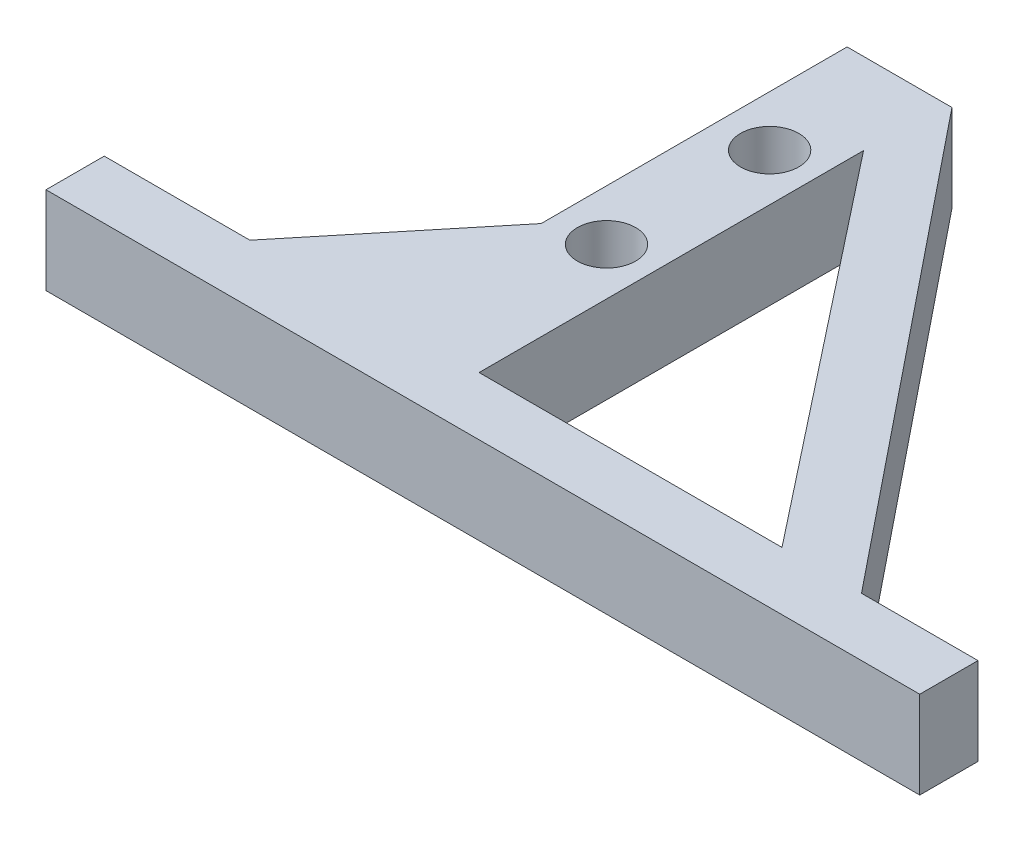
ISO-10303-21;
HEADER;
FILE_DESCRIPTION(('STEP AP214'),'2;1');
FILE_NAME('part.step','',(''),(''),'','','');
FILE_SCHEMA(('AUTOMOTIVE_DESIGN { 1 0 10303 214 1 1 1 1 }'));
ENDSEC;
DATA;
#1=APPLICATION_CONTEXT('core data for automotive mechanical design processes');
#2=APPLICATION_PROTOCOL_DEFINITION('international standard','automotive_design',2000,#1);
#3=PRODUCT_CONTEXT('',#1,'mechanical');
#4=PRODUCT('Part','Part','',(#3));
#5=PRODUCT_RELATED_PRODUCT_CATEGORY('part','',(#4));
#6=PRODUCT_DEFINITION_FORMATION('','',#4);
#7=PRODUCT_DEFINITION_CONTEXT('part definition',#1,'design');
#8=PRODUCT_DEFINITION('design','',#6,#7);
#9=PRODUCT_DEFINITION_SHAPE('','',#8);
#10=(LENGTH_UNIT() NAMED_UNIT(*) SI_UNIT(.MILLI.,.METRE.));
#11=(NAMED_UNIT(*) PLANE_ANGLE_UNIT() SI_UNIT($,.RADIAN.));
#12=(NAMED_UNIT(*) SI_UNIT($,.STERADIAN.) SOLID_ANGLE_UNIT());
#13=UNCERTAINTY_MEASURE_WITH_UNIT(LENGTH_MEASURE(1.E-05),#10,'distance_accuracy_value','');
#14=(GEOMETRIC_REPRESENTATION_CONTEXT(3) GLOBAL_UNCERTAINTY_ASSIGNED_CONTEXT((#13)) GLOBAL_UNIT_ASSIGNED_CONTEXT((#10,
#11,#12)) REPRESENTATION_CONTEXT('',''));
#15=CARTESIAN_POINT('',(0.,0.,0.));
#16=DIRECTION('',(0.,0.,1.));
#17=DIRECTION('',(1.,0.,0.));
#18=AXIS2_PLACEMENT_3D('',#15,#16,#17);
#19=CARTESIAN_POINT('',(0.,19.05,0.));
#20=DIRECTION('',(0.,-1.,0.));
#21=DIRECTION('',(0.,0.,-1.));
#22=AXIS2_PLACEMENT_3D('',#19,#20,#21);
#23=PLANE('',#22);
#24=DIRECTION('',(0.,0.,1.));
#25=VECTOR('',#24,1.);
#26=CARTESIAN_POINT('',(0.,19.05,0.));
#27=LINE('',#26,#25);
#28=CARTESIAN_POINT('',(0.,19.05,-12.7));
#29=VERTEX_POINT('',#28);
#30=CARTESIAN_POINT('',(0.,19.05,0.));
#31=VERTEX_POINT('',#30);
#32=EDGE_CURVE('E152',#29,#31,#27,.T.);
#33=ORIENTED_EDGE('',*,*,#32,.T.);
#34=DIRECTION('',(1.,0.,0.));
#35=VECTOR('',#34,1.);
#36=CARTESIAN_POINT('',(0.,19.05,0.));
#37=LINE('',#36,#35);
#38=CARTESIAN_POINT('',(190.5,19.05,0.));
#39=VERTEX_POINT('',#38);
#40=EDGE_CURVE('E155',#31,#39,#37,.T.);
#41=ORIENTED_EDGE('',*,*,#40,.T.);
#42=DIRECTION('',(0.,0.,-1.));
#43=VECTOR('',#42,1.);
#44=CARTESIAN_POINT('',(190.5,19.05,0.));
#45=LINE('',#44,#43);
#46=CARTESIAN_POINT('',(190.5,19.05,-12.7));
#47=VERTEX_POINT('',#46);
#48=EDGE_CURVE('E158',#39,#47,#45,.T.);
#49=ORIENTED_EDGE('',*,*,#48,.T.);
#50=DIRECTION('',(-1.,0.,0.));
#51=VECTOR('',#50,1.);
#52=CARTESIAN_POINT('',(165.1,19.05,-12.7));
#53=LINE('',#52,#51);
#54=CARTESIAN_POINT('',(165.1,19.05,-12.7));
#55=VERTEX_POINT('',#54);
#56=EDGE_CURVE('E160',#47,#55,#53,.T.);
#57=ORIENTED_EDGE('',*,*,#56,.T.);
#58=DIRECTION('',(-0.627483273754374,0.,-0.778630041263817));
#59=VECTOR('',#58,1.);
#60=CARTESIAN_POINT('',(83.2224750717733,19.05,-114.3));
#61=LINE('',#60,#59);
#62=CARTESIAN_POINT('',(83.2224750717733,19.05,-114.3));
#63=VERTEX_POINT('',#62);
#64=EDGE_CURVE('E162',#55,#63,#61,.T.);
#65=ORIENTED_EDGE('',*,*,#64,.T.);
#66=DIRECTION('',(-1.,0.,0.));
#67=VECTOR('',#66,1.);
#68=CARTESIAN_POINT('',(83.2224750717733,19.05,-114.3));
#69=LINE('',#68,#67);
#70=CARTESIAN_POINT('',(60.3624750717733,19.05,-114.3));
#71=VERTEX_POINT('',#70);
#72=EDGE_CURVE('E164',#63,#71,#69,.T.);
#73=ORIENTED_EDGE('',*,*,#72,.T.);
#74=DIRECTION('',(0.,0.,1.));
#75=VECTOR('',#74,1.);
#76=CARTESIAN_POINT('',(60.3624750717733,19.05,-114.3));
#77=LINE('',#76,#75);
#78=CARTESIAN_POINT('',(60.3624750717733,19.05,-47.5946150448349));
#79=VERTEX_POINT('',#78);
#80=EDGE_CURVE('E166',#71,#79,#77,.T.);
#81=ORIENTED_EDGE('',*,*,#80,.T.);
#82=DIRECTION('',(-0.634064889578644,0.,0.77327984313806));
#83=VECTOR('',#82,1.);
#84=CARTESIAN_POINT('',(31.75,19.05,-12.7));
#85=LINE('',#84,#83);
#86=CARTESIAN_POINT('',(31.75,19.05,-12.7));
#87=VERTEX_POINT('',#86);
#88=EDGE_CURVE('E168',#79,#87,#85,.T.);
#89=ORIENTED_EDGE('',*,*,#88,.T.);
#90=DIRECTION('',(-1.,0.,0.));
#91=VECTOR('',#90,1.);
#92=CARTESIAN_POINT('',(0.,19.05,-12.7));
#93=LINE('',#92,#91);
#94=EDGE_CURVE('E170',#87,#29,#93,.T.);
#95=ORIENTED_EDGE('',*,*,#94,.T.);
#96=EDGE_LOOP('',(#33,#41,#49,#57,#65,#73,#81,#89,#95));
#97=FACE_BOUND('',#96,.T.);
#98=DIRECTION('',(-0.618872226603513,0.,-0.785491672227535));
#99=VECTOR('',#98,1.);
#100=CARTESIAN_POINT('',(81.7257807197851,19.05,-96.52));
#101=LINE('',#100,#99);
#102=CARTESIAN_POINT('',(147.765780719785,19.05,-12.7));
#103=VERTEX_POINT('',#102);
#104=CARTESIAN_POINT('',(81.7257807197851,19.05,-96.52));
#105=VERTEX_POINT('',#104);
#106=EDGE_CURVE('E122',#103,#105,#101,.T.);
#107=ORIENTED_EDGE('',*,*,#106,.F.);
#108=DIRECTION('',(1.,0.,0.));
#109=VECTOR('',#108,1.);
#110=CARTESIAN_POINT('',(81.7257807197851,19.05,-12.7));
#111=LINE('',#110,#109);
#112=CARTESIAN_POINT('',(81.7257807197851,19.05,-12.7));
#113=VERTEX_POINT('',#112);
#114=EDGE_CURVE('E140',#113,#103,#111,.T.);
#115=ORIENTED_EDGE('',*,*,#114,.F.);
#116=DIRECTION('',(0.,0.,1.));
#117=VECTOR('',#116,1.);
#118=CARTESIAN_POINT('',(81.7257807197851,19.05,-96.52));
#119=LINE('',#118,#117);
#120=EDGE_CURVE('E130',#105,#113,#119,.T.);
#121=ORIENTED_EDGE('',*,*,#120,.F.);
#122=EDGE_LOOP('',(#107,#115,#121));
#123=FACE_BOUND('',#122,.T.);
#124=CARTESIAN_POINT('',(71.4131855565126,19.05,-86.36));
#125=DIRECTION('',(0.,1.,0.));
#126=DIRECTION('',(0.,0.,1.));
#127=AXIS2_PLACEMENT_3D('',#124,#125,#126);
#128=CIRCLE('',#127,6.34999999999999);
#129=CARTESIAN_POINT('',(71.4131855565126,19.05,-92.71));
#130=VERTEX_POINT('',#129);
#131=EDGE_CURVE('E146',#130,#130,#128,.T.);
#132=ORIENTED_EDGE('',*,*,#131,.F.);
#133=EDGE_LOOP('',(#132));
#134=FACE_BOUND('',#133,.T.);
#135=CARTESIAN_POINT('',(71.4131855565126,19.05,-50.8));
#136=DIRECTION('',(0.,1.,0.));
#137=DIRECTION('',(0.,0.,1.));
#138=AXIS2_PLACEMENT_3D('',#135,#136,#137);
#139=CIRCLE('',#138,6.35);
#140=CARTESIAN_POINT('',(71.4131855565126,19.05,-57.15));
#141=VERTEX_POINT('',#140);
#142=EDGE_CURVE('E391',#141,#141,#139,.T.);
#143=ORIENTED_EDGE('',*,*,#142,.F.);
#144=EDGE_LOOP('',(#143));
#145=FACE_BOUND('',#144,.T.);
#146=ADVANCED_FACE('F33',(#97,#123,#134,#145),#23,.F.);
#147=CARTESIAN_POINT('',(0.,0.,0.));
#148=DIRECTION('',(0.,-1.,0.));
#149=DIRECTION('',(0.,0.,-1.));
#150=AXIS2_PLACEMENT_3D('',#147,#148,#149);
#151=PLANE('',#150);
#152=CARTESIAN_POINT('',(71.4131855565126,0.,-86.36));
#153=DIRECTION('',(0.,1.,0.));
#154=DIRECTION('',(0.,0.,1.));
#155=AXIS2_PLACEMENT_3D('',#152,#153,#154);
#156=CIRCLE('',#155,6.34999999999999);
#157=CARTESIAN_POINT('',(71.4131855565126,0.,-92.71));
#158=VERTEX_POINT('',#157);
#159=EDGE_CURVE('E397',#158,#158,#156,.T.);
#160=ORIENTED_EDGE('',*,*,#159,.T.);
#161=EDGE_LOOP('',(#160));
#162=FACE_BOUND('',#161,.T.);
#163=DIRECTION('',(0.,0.,1.));
#164=VECTOR('',#163,1.);
#165=CARTESIAN_POINT('',(0.,0.,0.));
#166=LINE('',#165,#164);
#167=CARTESIAN_POINT('',(0.,0.,-12.7));
#168=VERTEX_POINT('',#167);
#169=CARTESIAN_POINT('',(0.,0.,0.));
#170=VERTEX_POINT('',#169);
#171=EDGE_CURVE('E137',#168,#170,#166,.T.);
#172=ORIENTED_EDGE('',*,*,#171,.F.);
#173=DIRECTION('',(-1.,0.,0.));
#174=VECTOR('',#173,1.);
#175=CARTESIAN_POINT('',(0.,0.,-12.7));
#176=LINE('',#175,#174);
#177=CARTESIAN_POINT('',(31.75,0.,-12.7));
#178=VERTEX_POINT('',#177);
#179=EDGE_CURVE('E156',#178,#168,#176,.T.);
#180=ORIENTED_EDGE('',*,*,#179,.F.);
#181=DIRECTION('',(-0.634064889578644,0.,0.77327984313806));
#182=VECTOR('',#181,1.);
#183=CARTESIAN_POINT('',(31.75,0.,-12.7));
#184=LINE('',#183,#182);
#185=CARTESIAN_POINT('',(60.3624750717733,0.,-47.5946150448349));
#186=VERTEX_POINT('',#185);
#187=EDGE_CURVE('E187',#186,#178,#184,.T.);
#188=ORIENTED_EDGE('',*,*,#187,.F.);
#189=DIRECTION('',(0.,0.,1.));
#190=VECTOR('',#189,1.);
#191=CARTESIAN_POINT('',(60.3624750717733,0.,-114.3));
#192=LINE('',#191,#190);
#193=CARTESIAN_POINT('',(60.3624750717733,0.,-114.3));
#194=VERTEX_POINT('',#193);
#195=EDGE_CURVE('E185',#194,#186,#192,.T.);
#196=ORIENTED_EDGE('',*,*,#195,.F.);
#197=DIRECTION('',(-1.,0.,0.));
#198=VECTOR('',#197,1.);
#199=CARTESIAN_POINT('',(83.2224750717733,0.,-114.3));
#200=LINE('',#199,#198);
#201=CARTESIAN_POINT('',(83.2224750717733,0.,-114.3));
#202=VERTEX_POINT('',#201);
#203=EDGE_CURVE('E183',#202,#194,#200,.T.);
#204=ORIENTED_EDGE('',*,*,#203,.F.);
#205=DIRECTION('',(-0.627483273754374,0.,-0.778630041263817));
#206=VECTOR('',#205,1.);
#207=CARTESIAN_POINT('',(83.2224750717733,0.,-114.3));
#208=LINE('',#207,#206);
#209=CARTESIAN_POINT('',(165.1,0.,-12.7));
#210=VERTEX_POINT('',#209);
#211=EDGE_CURVE('E181',#210,#202,#208,.T.);
#212=ORIENTED_EDGE('',*,*,#211,.F.);
#213=DIRECTION('',(-1.,0.,0.));
#214=VECTOR('',#213,1.);
#215=CARTESIAN_POINT('',(165.1,0.,-12.7));
#216=LINE('',#215,#214);
#217=CARTESIAN_POINT('',(190.5,0.,-12.7));
#218=VERTEX_POINT('',#217);
#219=EDGE_CURVE('E179',#218,#210,#216,.T.);
#220=ORIENTED_EDGE('',*,*,#219,.F.);
#221=DIRECTION('',(0.,0.,-1.));
#222=VECTOR('',#221,1.);
#223=CARTESIAN_POINT('',(190.5,0.,0.));
#224=LINE('',#223,#222);
#225=CARTESIAN_POINT('',(190.5,0.,0.));
#226=VERTEX_POINT('',#225);
#227=EDGE_CURVE('E177',#226,#218,#224,.T.);
#228=ORIENTED_EDGE('',*,*,#227,.F.);
#229=DIRECTION('',(1.,0.,0.));
#230=VECTOR('',#229,1.);
#231=CARTESIAN_POINT('',(0.,0.,0.));
#232=LINE('',#231,#230);
#233=EDGE_CURVE('E175',#170,#226,#232,.T.);
#234=ORIENTED_EDGE('',*,*,#233,.F.);
#235=EDGE_LOOP('',(#172,#180,#188,#196,#204,#212,#220,#228,#234));
#236=FACE_BOUND('',#235,.T.);
#237=DIRECTION('',(1.,0.,0.));
#238=VECTOR('',#237,1.);
#239=CARTESIAN_POINT('',(81.7257807197851,0.,-12.7));
#240=LINE('',#239,#238);
#241=CARTESIAN_POINT('',(81.7257807197851,0.,-12.7));
#242=VERTEX_POINT('',#241);
#243=CARTESIAN_POINT('',(147.765780719785,0.,-12.7));
#244=VERTEX_POINT('',#243);
#245=EDGE_CURVE('E131',#242,#244,#240,.T.);
#246=ORIENTED_EDGE('',*,*,#245,.T.);
#247=DIRECTION('',(-0.618872226603513,0.,-0.785491672227535));
#248=VECTOR('',#247,1.);
#249=CARTESIAN_POINT('',(81.7257807197851,0.,-96.52));
#250=LINE('',#249,#248);
#251=CARTESIAN_POINT('',(81.7257807197851,0.,-96.52));
#252=VERTEX_POINT('',#251);
#253=EDGE_CURVE('E56',#244,#252,#250,.T.);
#254=ORIENTED_EDGE('',*,*,#253,.T.);
#255=DIRECTION('',(0.,0.,1.));
#256=VECTOR('',#255,1.);
#257=CARTESIAN_POINT('',(81.7257807197851,0.,-96.52));
#258=LINE('',#257,#256);
#259=EDGE_CURVE('E136',#252,#242,#258,.T.);
#260=ORIENTED_EDGE('',*,*,#259,.T.);
#261=EDGE_LOOP('',(#246,#254,#260));
#262=FACE_BOUND('',#261,.T.);
#263=CARTESIAN_POINT('',(71.4131855565126,0.,-50.8));
#264=DIRECTION('',(0.,1.,0.));
#265=DIRECTION('',(0.,0.,1.));
#266=AXIS2_PLACEMENT_3D('',#263,#264,#265);
#267=CIRCLE('',#266,6.35);
#268=CARTESIAN_POINT('',(71.4131855565126,0.,-57.15));
#269=VERTEX_POINT('',#268);
#270=EDGE_CURVE('E394',#269,#269,#267,.T.);
#271=ORIENTED_EDGE('',*,*,#270,.T.);
#272=EDGE_LOOP('',(#271));
#273=FACE_BOUND('',#272,.T.);
#274=ADVANCED_FACE('F220',(#162,#236,#262,#273),#151,.T.);
#275=CARTESIAN_POINT('',(0.,19.05,0.));
#276=DIRECTION('',(1.,0.,0.));
#277=DIRECTION('',(0.,0.,-1.));
#278=AXIS2_PLACEMENT_3D('',#275,#276,#277);
#279=PLANE('',#278);
#280=ORIENTED_EDGE('',*,*,#171,.T.);
#281=DIRECTION('',(0.,-1.,0.));
#282=VECTOR('',#281,1.);
#283=CARTESIAN_POINT('',(0.,19.05,0.));
#284=LINE('',#283,#282);
#285=EDGE_CURVE('E11',#31,#170,#284,.T.);
#286=ORIENTED_EDGE('',*,*,#285,.F.);
#287=ORIENTED_EDGE('',*,*,#32,.F.);
#288=DIRECTION('',(0.,-1.,0.));
#289=VECTOR('',#288,1.);
#290=CARTESIAN_POINT('',(0.,19.05,-12.7));
#291=LINE('',#290,#289);
#292=EDGE_CURVE('E172',#29,#168,#291,.T.);
#293=ORIENTED_EDGE('',*,*,#292,.T.);
#294=EDGE_LOOP('',(#280,#286,#287,#293));
#295=FACE_BOUND('',#294,.T.);
#296=ADVANCED_FACE('F35',(#295),#279,.F.);
#297=CARTESIAN_POINT('',(0.,19.05,0.));
#298=DIRECTION('',(0.,0.,-1.));
#299=DIRECTION('',(-1.,0.,0.));
#300=AXIS2_PLACEMENT_3D('',#297,#298,#299);
#301=PLANE('',#300);
#302=ORIENTED_EDGE('',*,*,#233,.T.);
#303=DIRECTION('',(0.,-1.,0.));
#304=VECTOR('',#303,1.);
#305=CARTESIAN_POINT('',(190.5,19.05,0.));
#306=LINE('',#305,#304);
#307=EDGE_CURVE('E41',#39,#226,#306,.T.);
#308=ORIENTED_EDGE('',*,*,#307,.F.);
#309=ORIENTED_EDGE('',*,*,#40,.F.);
#310=ORIENTED_EDGE('',*,*,#285,.T.);
#311=EDGE_LOOP('',(#302,#308,#309,#310));
#312=FACE_BOUND('',#311,.T.);
#313=ADVANCED_FACE('F237',(#312),#301,.F.);
#314=CARTESIAN_POINT('',(190.5,19.05,0.));
#315=DIRECTION('',(-1.,0.,0.));
#316=DIRECTION('',(0.,0.,1.));
#317=AXIS2_PLACEMENT_3D('',#314,#315,#316);
#318=PLANE('',#317);
#319=ORIENTED_EDGE('',*,*,#227,.T.);
#320=DIRECTION('',(0.,-1.,0.));
#321=VECTOR('',#320,1.);
#322=CARTESIAN_POINT('',(190.5,19.05,-12.7));
#323=LINE('',#322,#321);
#324=EDGE_CURVE('E207',#47,#218,#323,.T.);
#325=ORIENTED_EDGE('',*,*,#324,.F.);
#326=ORIENTED_EDGE('',*,*,#48,.F.);
#327=ORIENTED_EDGE('',*,*,#307,.T.);
#328=EDGE_LOOP('',(#319,#325,#326,#327));
#329=FACE_BOUND('',#328,.T.);
#330=ADVANCED_FACE('F214',(#329),#318,.F.);
#331=CARTESIAN_POINT('',(165.1,19.05,-12.7));
#332=DIRECTION('',(0.,0.,1.));
#333=DIRECTION('',(1.,0.,0.));
#334=AXIS2_PLACEMENT_3D('',#331,#332,#333);
#335=PLANE('',#334);
#336=ORIENTED_EDGE('',*,*,#219,.T.);
#337=DIRECTION('',(0.,-1.,0.));
#338=VECTOR('',#337,1.);
#339=CARTESIAN_POINT('',(165.1,19.05,-12.7));
#340=LINE('',#339,#338);
#341=EDGE_CURVE('E204',#55,#210,#340,.T.);
#342=ORIENTED_EDGE('',*,*,#341,.F.);
#343=ORIENTED_EDGE('',*,*,#56,.F.);
#344=ORIENTED_EDGE('',*,*,#324,.T.);
#345=EDGE_LOOP('',(#336,#342,#343,#344));
#346=FACE_BOUND('',#345,.T.);
#347=ADVANCED_FACE('F226',(#346),#335,.F.);
#348=CARTESIAN_POINT('',(83.2224750717733,19.05,-114.3));
#349=DIRECTION('',(-0.778630041263817,0.,0.627483273754374));
#350=DIRECTION('',(0.627483273754374,0.,0.778630041263817));
#351=AXIS2_PLACEMENT_3D('',#348,#349,#350);
#352=PLANE('',#351);
#353=ORIENTED_EDGE('',*,*,#211,.T.);
#354=DIRECTION('',(0.,-1.,0.));
#355=VECTOR('',#354,1.);
#356=CARTESIAN_POINT('',(83.2224750717733,19.05,-114.3));
#357=LINE('',#356,#355);
#358=EDGE_CURVE('E201',#63,#202,#357,.T.);
#359=ORIENTED_EDGE('',*,*,#358,.F.);
#360=ORIENTED_EDGE('',*,*,#64,.F.);
#361=ORIENTED_EDGE('',*,*,#341,.T.);
#362=EDGE_LOOP('',(#353,#359,#360,#361));
#363=FACE_BOUND('',#362,.T.);
#364=ADVANCED_FACE('F230',(#363),#352,.F.);
#365=CARTESIAN_POINT('',(83.2224750717733,19.05,-114.3));
#366=DIRECTION('',(0.,0.,1.));
#367=DIRECTION('',(1.,0.,0.));
#368=AXIS2_PLACEMENT_3D('',#365,#366,#367);
#369=PLANE('',#368);
#370=ORIENTED_EDGE('',*,*,#203,.T.);
#371=DIRECTION('',(0.,-1.,0.));
#372=VECTOR('',#371,1.);
#373=CARTESIAN_POINT('',(60.3624750717733,19.05,-114.3));
#374=LINE('',#373,#372);
#375=EDGE_CURVE('E198',#71,#194,#374,.T.);
#376=ORIENTED_EDGE('',*,*,#375,.F.);
#377=ORIENTED_EDGE('',*,*,#72,.F.);
#378=ORIENTED_EDGE('',*,*,#358,.T.);
#379=EDGE_LOOP('',(#370,#376,#377,#378));
#380=FACE_BOUND('',#379,.T.);
#381=ADVANCED_FACE('F255',(#380),#369,.F.);
#382=CARTESIAN_POINT('',(60.3624750717733,19.05,-114.3));
#383=DIRECTION('',(1.,0.,0.));
#384=DIRECTION('',(0.,0.,-1.));
#385=AXIS2_PLACEMENT_3D('',#382,#383,#384);
#386=PLANE('',#385);
#387=ORIENTED_EDGE('',*,*,#195,.T.);
#388=DIRECTION('',(0.,-1.,0.));
#389=VECTOR('',#388,1.);
#390=CARTESIAN_POINT('',(60.3624750717733,19.05,-47.5946150448349));
#391=LINE('',#390,#389);
#392=EDGE_CURVE('E195',#79,#186,#391,.T.);
#393=ORIENTED_EDGE('',*,*,#392,.F.);
#394=ORIENTED_EDGE('',*,*,#80,.F.);
#395=ORIENTED_EDGE('',*,*,#375,.T.);
#396=EDGE_LOOP('',(#387,#393,#394,#395));
#397=FACE_BOUND('',#396,.T.);
#398=ADVANCED_FACE('F253',(#397),#386,.F.);
#399=CARTESIAN_POINT('',(31.75,19.05,-12.7));
#400=DIRECTION('',(0.77327984313806,0.,0.634064889578644));
#401=DIRECTION('',(0.634064889578644,0.,-0.77327984313806));
#402=AXIS2_PLACEMENT_3D('',#399,#400,#401);
#403=PLANE('',#402);
#404=ORIENTED_EDGE('',*,*,#187,.T.);
#405=DIRECTION('',(0.,-1.,0.));
#406=VECTOR('',#405,1.);
#407=CARTESIAN_POINT('',(31.75,19.05,-12.7));
#408=LINE('',#407,#406);
#409=EDGE_CURVE('E192',#87,#178,#408,.T.);
#410=ORIENTED_EDGE('',*,*,#409,.F.);
#411=ORIENTED_EDGE('',*,*,#88,.F.);
#412=ORIENTED_EDGE('',*,*,#392,.T.);
#413=EDGE_LOOP('',(#404,#410,#411,#412));
#414=FACE_BOUND('',#413,.T.);
#415=ADVANCED_FACE('F249',(#414),#403,.F.);
#416=CARTESIAN_POINT('',(0.,19.05,-12.7));
#417=DIRECTION('',(0.,0.,1.));
#418=DIRECTION('',(1.,0.,0.));
#419=AXIS2_PLACEMENT_3D('',#416,#417,#418);
#420=PLANE('',#419);
#421=ORIENTED_EDGE('',*,*,#179,.T.);
#422=ORIENTED_EDGE('',*,*,#292,.F.);
#423=ORIENTED_EDGE('',*,*,#94,.F.);
#424=ORIENTED_EDGE('',*,*,#409,.T.);
#425=EDGE_LOOP('',(#421,#422,#423,#424));
#426=FACE_BOUND('',#425,.T.);
#427=ADVANCED_FACE('F244',(#426),#420,.F.);
#428=CARTESIAN_POINT('',(81.7257807197851,19.05,-96.52));
#429=DIRECTION('',(-0.785491672227535,0.,0.618872226603513));
#430=DIRECTION('',(0.618872226603513,0.,0.785491672227536));
#431=AXIS2_PLACEMENT_3D('',#428,#429,#430);
#432=PLANE('',#431);
#433=ORIENTED_EDGE('',*,*,#253,.F.);
#434=DIRECTION('',(0.,-1.,0.));
#435=VECTOR('',#434,1.);
#436=CARTESIAN_POINT('',(147.765780719785,19.05,-12.7));
#437=LINE('',#436,#435);
#438=EDGE_CURVE('E126',#103,#244,#437,.T.);
#439=ORIENTED_EDGE('',*,*,#438,.F.);
#440=ORIENTED_EDGE('',*,*,#106,.T.);
#441=DIRECTION('',(0.,-1.,0.));
#442=VECTOR('',#441,1.);
#443=CARTESIAN_POINT('',(81.7257807197851,19.05,-96.52));
#444=LINE('',#443,#442);
#445=EDGE_CURVE('E125',#105,#252,#444,.T.);
#446=ORIENTED_EDGE('',*,*,#445,.T.);
#447=EDGE_LOOP('',(#433,#439,#440,#446));
#448=FACE_BOUND('',#447,.T.);
#449=ADVANCED_FACE('F124',(#448),#432,.T.);
#450=CARTESIAN_POINT('',(81.7257807197851,19.05,-96.52));
#451=DIRECTION('',(1.,0.,0.));
#452=DIRECTION('',(0.,0.,-1.));
#453=AXIS2_PLACEMENT_3D('',#450,#451,#452);
#454=PLANE('',#453);
#455=ORIENTED_EDGE('',*,*,#259,.F.);
#456=ORIENTED_EDGE('',*,*,#445,.F.);
#457=ORIENTED_EDGE('',*,*,#120,.T.);
#458=DIRECTION('',(0.,-1.,0.));
#459=VECTOR('',#458,1.);
#460=CARTESIAN_POINT('',(81.7257807197851,19.05,-12.7));
#461=LINE('',#460,#459);
#462=EDGE_CURVE('E48',#113,#242,#461,.T.);
#463=ORIENTED_EDGE('',*,*,#462,.T.);
#464=EDGE_LOOP('',(#455,#456,#457,#463));
#465=FACE_BOUND('',#464,.T.);
#466=ADVANCED_FACE('F134',(#465),#454,.T.);
#467=CARTESIAN_POINT('',(81.7257807197851,19.05,-12.7));
#468=DIRECTION('',(0.,0.,-1.));
#469=DIRECTION('',(-1.,0.,0.));
#470=AXIS2_PLACEMENT_3D('',#467,#468,#469);
#471=PLANE('',#470);
#472=ORIENTED_EDGE('',*,*,#245,.F.);
#473=ORIENTED_EDGE('',*,*,#462,.F.);
#474=ORIENTED_EDGE('',*,*,#114,.T.);
#475=ORIENTED_EDGE('',*,*,#438,.T.);
#476=EDGE_LOOP('',(#472,#473,#474,#475));
#477=FACE_BOUND('',#476,.T.);
#478=ADVANCED_FACE('F296',(#477),#471,.T.);
#479=CARTESIAN_POINT('',(71.4131855565126,19.05,-86.36));
#480=DIRECTION('',(0.,-1.,0.));
#481=DIRECTION('',(0.,0.,-1.));
#482=AXIS2_PLACEMENT_3D('',#479,#480,#481);
#483=CYLINDRICAL_SURFACE('',#482,6.34999999999999);
#484=CARTESIAN_POINT('',(71.4131855565126,19.05,-92.71));
#485=CARTESIAN_POINT('',(71.4131855565126,18.8515625,-92.71));
#486=CARTESIAN_POINT('',(71.4131855565126,18.653125,-92.71));
#487=CARTESIAN_POINT('',(71.4131855565126,18.25625,-92.71));
#488=CARTESIAN_POINT('',(71.4131855565126,18.0578125,-92.71));
#489=CARTESIAN_POINT('',(71.4131855565126,17.6609375,-92.71));
#490=CARTESIAN_POINT('',(71.4131855565126,17.4625,-92.71));
#491=CARTESIAN_POINT('',(71.4131855565126,17.065625,-92.71));
#492=CARTESIAN_POINT('',(71.4131855565126,16.8671875,-92.71));
#493=CARTESIAN_POINT('',(71.4131855565126,16.4703125,-92.71));
#494=CARTESIAN_POINT('',(71.4131855565126,16.271875,-92.71));
#495=CARTESIAN_POINT('',(71.4131855565126,15.875,-92.71));
#496=CARTESIAN_POINT('',(71.4131855565126,15.6765625,-92.71));
#497=CARTESIAN_POINT('',(71.4131855565126,15.2796875,-92.71));
#498=CARTESIAN_POINT('',(71.4131855565126,15.08125,-92.71));
#499=CARTESIAN_POINT('',(71.4131855565126,14.684375,-92.71));
#500=CARTESIAN_POINT('',(71.4131855565126,14.4859375,-92.71));
#501=CARTESIAN_POINT('',(71.4131855565126,14.0890625,-92.71));
#502=CARTESIAN_POINT('',(71.4131855565126,13.890625,-92.71));
#503=CARTESIAN_POINT('',(71.4131855565126,13.49375,-92.71));
#504=CARTESIAN_POINT('',(71.4131855565126,13.2953125,-92.71));
#505=CARTESIAN_POINT('',(71.4131855565126,12.8984375,-92.71));
#506=CARTESIAN_POINT('',(71.4131855565126,12.7,-92.71));
#507=CARTESIAN_POINT('',(71.4131855565126,12.303125,-92.71));
#508=CARTESIAN_POINT('',(71.4131855565126,12.1046875,-92.71));
#509=CARTESIAN_POINT('',(71.4131855565126,11.7078125,-92.71));
#510=CARTESIAN_POINT('',(71.4131855565126,11.509375,-92.71));
#511=CARTESIAN_POINT('',(71.4131855565126,11.1125,-92.71));
#512=CARTESIAN_POINT('',(71.4131855565126,10.9140625,-92.71));
#513=CARTESIAN_POINT('',(71.4131855565126,10.5171875,-92.71));
#514=CARTESIAN_POINT('',(71.4131855565126,10.31875,-92.71));
#515=CARTESIAN_POINT('',(71.4131855565126,9.921875,-92.71));
#516=CARTESIAN_POINT('',(71.4131855565126,9.7234375,-92.71));
#517=CARTESIAN_POINT('',(71.4131855565126,9.3265625,-92.71));
#518=CARTESIAN_POINT('',(71.4131855565126,9.128125,-92.71));
#519=CARTESIAN_POINT('',(71.4131855565126,8.73125,-92.71));
#520=CARTESIAN_POINT('',(71.4131855565126,8.5328125,-92.71));
#521=CARTESIAN_POINT('',(71.4131855565126,8.1359375,-92.71));
#522=CARTESIAN_POINT('',(71.4131855565126,7.9375,-92.71));
#523=CARTESIAN_POINT('',(71.4131855565126,7.540625,-92.71));
#524=CARTESIAN_POINT('',(71.4131855565126,7.3421875,-92.71));
#525=CARTESIAN_POINT('',(71.4131855565126,6.9453125,-92.71));
#526=CARTESIAN_POINT('',(71.4131855565126,6.746875,-92.71));
#527=CARTESIAN_POINT('',(71.4131855565126,6.35,-92.71));
#528=CARTESIAN_POINT('',(71.4131855565126,6.1515625,-92.71));
#529=CARTESIAN_POINT('',(71.4131855565126,5.7546875,-92.71));
#530=CARTESIAN_POINT('',(71.4131855565126,5.55625,-92.71));
#531=CARTESIAN_POINT('',(71.4131855565126,5.159375,-92.71));
#532=CARTESIAN_POINT('',(71.4131855565126,4.9609375,-92.71));
#533=CARTESIAN_POINT('',(71.4131855565126,4.5640625,-92.71));
#534=CARTESIAN_POINT('',(71.4131855565126,4.365625,-92.71));
#535=CARTESIAN_POINT('',(71.4131855565126,3.96875,-92.71));
#536=CARTESIAN_POINT('',(71.4131855565126,3.7703125,-92.71));
#537=CARTESIAN_POINT('',(71.4131855565126,3.3734375,-92.71));
#538=CARTESIAN_POINT('',(71.4131855565126,3.175,-92.71));
#539=CARTESIAN_POINT('',(71.4131855565126,2.778125,-92.71));
#540=CARTESIAN_POINT('',(71.4131855565126,2.5796875,-92.71));
#541=CARTESIAN_POINT('',(71.4131855565126,2.1828125,-92.71));
#542=CARTESIAN_POINT('',(71.4131855565126,1.984375,-92.71));
#543=CARTESIAN_POINT('',(71.4131855565126,1.5875,-92.71));
#544=CARTESIAN_POINT('',(71.4131855565126,1.3890625,-92.71));
#545=CARTESIAN_POINT('',(71.4131855565126,0.992187500000001,-92.71));
#546=CARTESIAN_POINT('',(71.4131855565126,0.793750000000001,-92.71));
#547=CARTESIAN_POINT('',(71.4131855565126,0.396875,-92.71));
#548=CARTESIAN_POINT('',(71.4131855565126,0.1984375,-92.71));
#549=CARTESIAN_POINT('',(71.4131855565126,0.,-92.71));
#550=B_SPLINE_CURVE_WITH_KNOTS('',3,(#484,#485,#486,#487,#488,#489,#490,#491,#492,#493,#494,
#495,#496,#497,#498,#499,#500,#501,#502,#503,#504,#505,#506,#507,#508,#509,#510,#511,#512,#513,
#514,#515,#516,#517,#518,#519,#520,#521,#522,#523,#524,#525,#526,#527,#528,#529,#530,#531,#532,
#533,#534,#535,#536,#537,#538,#539,#540,#541,#542,#543,#544,#545,#546,#547,#548,#549),
.UNSPECIFIED.,.F.,.F.,(4,2,2,2,2,2,2,2,2,2,2,2,2,2,2,2,2,2,2,2,2,2,2,2,2,2,2,2,2,2,2,2,4),(0.,
0.5953125,1.190625,1.7859375,2.38125,2.9765625,3.571875,4.1671875,4.7625,5.3578125,5.953125,
6.5484375,7.14375,7.7390625,8.334375,8.9296875,9.525,10.1203125,10.715625,11.3109375,11.90625,
12.5015625,13.096875,13.6921875,14.2875,14.8828125,15.478125,16.0734375,16.66875,17.2640625,
17.859375,18.4546875,19.05),.UNSPECIFIED.);
#551=EDGE_CURVE('BSEAM302',#130,#158,#550,.T.);
#552=ORIENTED_EDGE('',*,*,#131,.T.);
#553=ORIENTED_EDGE('',*,*,#159,.F.);
#554=ORIENTED_EDGE('',*,*,#551,.T.);
#555=ORIENTED_EDGE('',*,*,#551,.F.);
#556=EDGE_LOOP('',(#552,#554,#553,#555));
#557=FACE_BOUND('',#556,.T.);
#558=ADVANCED_FACE('F302',(#557),#483,.F.);
#559=CARTESIAN_POINT('',(71.4131855565126,19.05,-50.8));
#560=DIRECTION('',(0.,-1.,0.));
#561=DIRECTION('',(0.,0.,-1.));
#562=AXIS2_PLACEMENT_3D('',#559,#560,#561);
#563=CYLINDRICAL_SURFACE('',#562,6.35);
#564=CARTESIAN_POINT('',(71.4131855565126,19.05,-57.15));
#565=CARTESIAN_POINT('',(71.4131855565126,18.8515625,-57.15));
#566=CARTESIAN_POINT('',(71.4131855565126,18.653125,-57.15));
#567=CARTESIAN_POINT('',(71.4131855565126,18.25625,-57.15));
#568=CARTESIAN_POINT('',(71.4131855565126,18.0578125,-57.15));
#569=CARTESIAN_POINT('',(71.4131855565126,17.6609375,-57.15));
#570=CARTESIAN_POINT('',(71.4131855565126,17.4625,-57.15));
#571=CARTESIAN_POINT('',(71.4131855565126,17.065625,-57.15));
#572=CARTESIAN_POINT('',(71.4131855565126,16.8671875,-57.15));
#573=CARTESIAN_POINT('',(71.4131855565126,16.4703125,-57.15));
#574=CARTESIAN_POINT('',(71.4131855565126,16.271875,-57.15));
#575=CARTESIAN_POINT('',(71.4131855565126,15.875,-57.15));
#576=CARTESIAN_POINT('',(71.4131855565126,15.6765625,-57.15));
#577=CARTESIAN_POINT('',(71.4131855565126,15.2796875,-57.15));
#578=CARTESIAN_POINT('',(71.4131855565126,15.08125,-57.15));
#579=CARTESIAN_POINT('',(71.4131855565126,14.684375,-57.15));
#580=CARTESIAN_POINT('',(71.4131855565126,14.4859375,-57.15));
#581=CARTESIAN_POINT('',(71.4131855565126,14.0890625,-57.15));
#582=CARTESIAN_POINT('',(71.4131855565126,13.890625,-57.15));
#583=CARTESIAN_POINT('',(71.4131855565126,13.49375,-57.15));
#584=CARTESIAN_POINT('',(71.4131855565126,13.2953125,-57.15));
#585=CARTESIAN_POINT('',(71.4131855565126,12.8984375,-57.15));
#586=CARTESIAN_POINT('',(71.4131855565126,12.7,-57.15));
#587=CARTESIAN_POINT('',(71.4131855565126,12.303125,-57.15));
#588=CARTESIAN_POINT('',(71.4131855565126,12.1046875,-57.15));
#589=CARTESIAN_POINT('',(71.4131855565126,11.7078125,-57.15));
#590=CARTESIAN_POINT('',(71.4131855565126,11.509375,-57.15));
#591=CARTESIAN_POINT('',(71.4131855565126,11.1125,-57.15));
#592=CARTESIAN_POINT('',(71.4131855565126,10.9140625,-57.15));
#593=CARTESIAN_POINT('',(71.4131855565126,10.5171875,-57.15));
#594=CARTESIAN_POINT('',(71.4131855565126,10.31875,-57.15));
#595=CARTESIAN_POINT('',(71.4131855565126,9.921875,-57.15));
#596=CARTESIAN_POINT('',(71.4131855565126,9.7234375,-57.15));
#597=CARTESIAN_POINT('',(71.4131855565126,9.3265625,-57.15));
#598=CARTESIAN_POINT('',(71.4131855565126,9.128125,-57.15));
#599=CARTESIAN_POINT('',(71.4131855565126,8.73125,-57.15));
#600=CARTESIAN_POINT('',(71.4131855565126,8.5328125,-57.15));
#601=CARTESIAN_POINT('',(71.4131855565126,8.1359375,-57.15));
#602=CARTESIAN_POINT('',(71.4131855565126,7.9375,-57.15));
#603=CARTESIAN_POINT('',(71.4131855565126,7.540625,-57.15));
#604=CARTESIAN_POINT('',(71.4131855565126,7.3421875,-57.15));
#605=CARTESIAN_POINT('',(71.4131855565126,6.9453125,-57.15));
#606=CARTESIAN_POINT('',(71.4131855565126,6.746875,-57.15));
#607=CARTESIAN_POINT('',(71.4131855565126,6.35,-57.15));
#608=CARTESIAN_POINT('',(71.4131855565126,6.1515625,-57.15));
#609=CARTESIAN_POINT('',(71.4131855565126,5.7546875,-57.15));
#610=CARTESIAN_POINT('',(71.4131855565126,5.55625,-57.15));
#611=CARTESIAN_POINT('',(71.4131855565126,5.159375,-57.15));
#612=CARTESIAN_POINT('',(71.4131855565126,4.9609375,-57.15));
#613=CARTESIAN_POINT('',(71.4131855565126,4.5640625,-57.15));
#614=CARTESIAN_POINT('',(71.4131855565126,4.365625,-57.15));
#615=CARTESIAN_POINT('',(71.4131855565126,3.96875,-57.15));
#616=CARTESIAN_POINT('',(71.4131855565126,3.7703125,-57.15));
#617=CARTESIAN_POINT('',(71.4131855565126,3.3734375,-57.15));
#618=CARTESIAN_POINT('',(71.4131855565126,3.175,-57.15));
#619=CARTESIAN_POINT('',(71.4131855565126,2.778125,-57.15));
#620=CARTESIAN_POINT('',(71.4131855565126,2.5796875,-57.15));
#621=CARTESIAN_POINT('',(71.4131855565126,2.1828125,-57.15));
#622=CARTESIAN_POINT('',(71.4131855565126,1.984375,-57.15));
#623=CARTESIAN_POINT('',(71.4131855565126,1.5875,-57.15));
#624=CARTESIAN_POINT('',(71.4131855565126,1.3890625,-57.15));
#625=CARTESIAN_POINT('',(71.4131855565126,0.992187500000001,-57.15));
#626=CARTESIAN_POINT('',(71.4131855565126,0.793750000000001,-57.15));
#627=CARTESIAN_POINT('',(71.4131855565126,0.396875,-57.15));
#628=CARTESIAN_POINT('',(71.4131855565126,0.1984375,-57.15));
#629=CARTESIAN_POINT('',(71.4131855565126,0.,-57.15));
#630=B_SPLINE_CURVE_WITH_KNOTS('',3,(#564,#565,#566,#567,#568,#569,#570,#571,#572,#573,#574,
#575,#576,#577,#578,#579,#580,#581,#582,#583,#584,#585,#586,#587,#588,#589,#590,#591,#592,#593,
#594,#595,#596,#597,#598,#599,#600,#601,#602,#603,#604,#605,#606,#607,#608,#609,#610,#611,#612,
#613,#614,#615,#616,#617,#618,#619,#620,#621,#622,#623,#624,#625,#626,#627,#628,#629),
.UNSPECIFIED.,.F.,.F.,(4,2,2,2,2,2,2,2,2,2,2,2,2,2,2,2,2,2,2,2,2,2,2,2,2,2,2,2,2,2,2,2,4),(0.,
0.5953125,1.190625,1.7859375,2.38125,2.9765625,3.571875,4.1671875,4.7625,5.3578125,5.953125,
6.5484375,7.14375,7.7390625,8.334375,8.9296875,9.525,10.1203125,10.715625,11.3109375,11.90625,
12.5015625,13.096875,13.6921875,14.2875,14.8828125,15.478125,16.0734375,16.66875,17.2640625,
17.859375,18.4546875,19.05),.UNSPECIFIED.);
#631=EDGE_CURVE('BSEAM309',#141,#269,#630,.T.);
#632=ORIENTED_EDGE('',*,*,#142,.T.);
#633=ORIENTED_EDGE('',*,*,#270,.F.);
#634=ORIENTED_EDGE('',*,*,#631,.T.);
#635=ORIENTED_EDGE('',*,*,#631,.F.);
#636=EDGE_LOOP('',(#632,#634,#633,#635));
#637=FACE_BOUND('',#636,.T.);
#638=ADVANCED_FACE('F309',(#637),#563,.F.);
#639=CLOSED_SHELL('',(#146,#274,#296,#313,#330,#347,#364,#381,#398,#415,#427,#449,#466,#478,
#558,#638));
#640=MANIFOLD_SOLID_BREP('B2',#639);
#641=ADVANCED_BREP_SHAPE_REPRESENTATION('',(#18,#640),#14);
#642=SHAPE_DEFINITION_REPRESENTATION(#9,#641);
ENDSEC;
END-ISO-10303-21;
